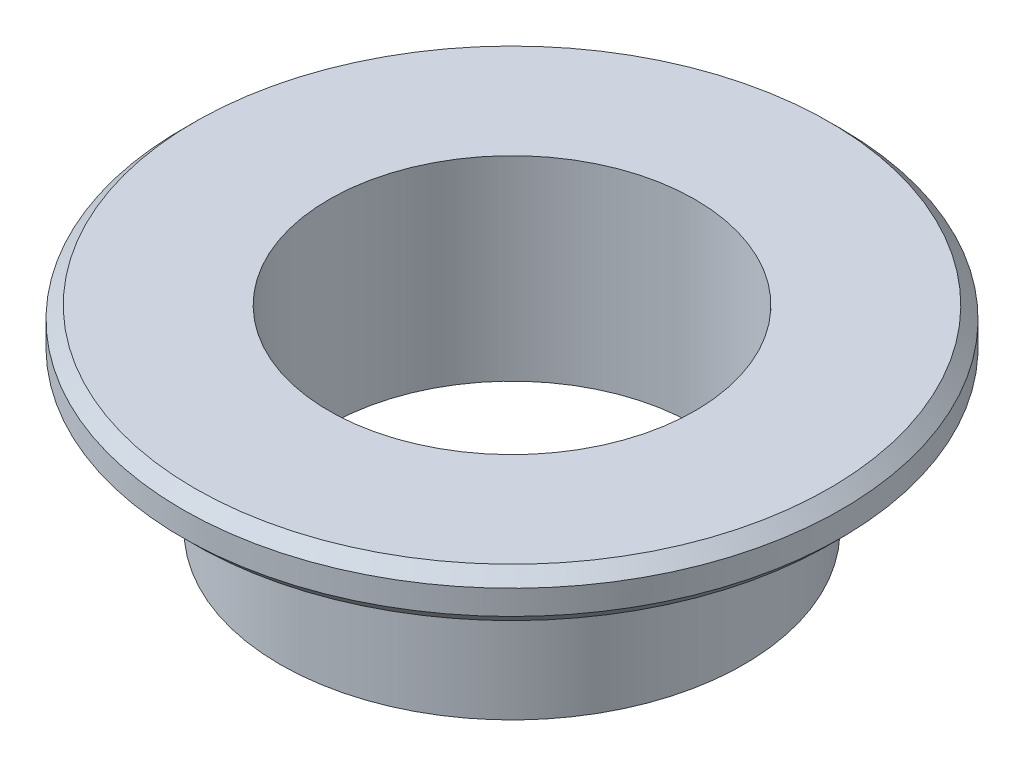
ISO-10303-21;
HEADER;
FILE_DESCRIPTION(('STEP AP214'),'2;1');
FILE_NAME('part.step','',(''),(''),'','','');
FILE_SCHEMA(('AUTOMOTIVE_DESIGN { 1 0 10303 214 1 1 1 1 }'));
ENDSEC;
DATA;
#1=APPLICATION_CONTEXT('core data for automotive mechanical design processes');
#2=APPLICATION_PROTOCOL_DEFINITION('international standard','automotive_design',2000,#1);
#3=PRODUCT_CONTEXT('',#1,'mechanical');
#4=PRODUCT('Part','Part','',(#3));
#5=PRODUCT_RELATED_PRODUCT_CATEGORY('part','',(#4));
#6=PRODUCT_DEFINITION_FORMATION('','',#4);
#7=PRODUCT_DEFINITION_CONTEXT('part definition',#1,'design');
#8=PRODUCT_DEFINITION('design','',#6,#7);
#9=PRODUCT_DEFINITION_SHAPE('','',#8);
#10=(LENGTH_UNIT() NAMED_UNIT(*) SI_UNIT(.MILLI.,.METRE.));
#11=(NAMED_UNIT(*) PLANE_ANGLE_UNIT() SI_UNIT($,.RADIAN.));
#12=(NAMED_UNIT(*) SI_UNIT($,.STERADIAN.) SOLID_ANGLE_UNIT());
#13=UNCERTAINTY_MEASURE_WITH_UNIT(LENGTH_MEASURE(1.E-05),#10,'distance_accuracy_value','');
#14=(GEOMETRIC_REPRESENTATION_CONTEXT(3) GLOBAL_UNCERTAINTY_ASSIGNED_CONTEXT((#13)) GLOBAL_UNIT_ASSIGNED_CONTEXT((#10,
#11,#12)) REPRESENTATION_CONTEXT('',''));
#15=CARTESIAN_POINT('',(0.,0.,0.));
#16=DIRECTION('',(0.,0.,1.));
#17=DIRECTION('',(1.,0.,0.));
#18=AXIS2_PLACEMENT_3D('',#15,#16,#17);
#19=CARTESIAN_POINT('',(13.5,8.,0.));
#20=DIRECTION('',(0.,1.,0.));
#21=DIRECTION('',(0.,0.,1.));
#22=AXIS2_PLACEMENT_3D('',#19,#20,#21);
#23=PLANE('',#22);
#24=CARTESIAN_POINT('',(0.,8.,0.));
#25=DIRECTION('',(0.,1.,0.));
#26=DIRECTION('',(0.,0.,1.));
#27=AXIS2_PLACEMENT_3D('',#24,#25,#26);
#28=CIRCLE('',#27,13.);
#29=CARTESIAN_POINT('',(0.,8.,13.));
#30=VERTEX_POINT('',#29);
#31=EDGE_CURVE('E10',#30,#30,#28,.T.);
#32=ORIENTED_EDGE('',*,*,#31,.T.);
#33=EDGE_LOOP('',(#32));
#34=FACE_BOUND('',#33,.T.);
#35=CARTESIAN_POINT('',(0.,8.,0.));
#36=DIRECTION('',(0.,-1.,0.));
#37=DIRECTION('',(0.,0.,-1.));
#38=AXIS2_PLACEMENT_3D('',#35,#36,#37);
#39=CIRCLE('',#38,7.5);
#40=CARTESIAN_POINT('',(0.,8.,-7.5));
#41=VERTEX_POINT('',#40);
#42=EDGE_CURVE('E64',#41,#41,#39,.T.);
#43=ORIENTED_EDGE('',*,*,#42,.T.);
#44=EDGE_LOOP('',(#43));
#45=FACE_BOUND('',#44,.T.);
#46=ADVANCED_FACE('F39',(#34,#45),#23,.T.);
#47=CARTESIAN_POINT('',(0.,0.,0.));
#48=DIRECTION('',(0.,-1.,0.));
#49=DIRECTION('',(0.,0.,-1.));
#50=AXIS2_PLACEMENT_3D('',#47,#48,#49);
#51=CYLINDRICAL_SURFACE('',#50,7.5);
#52=CARTESIAN_POINT('',(0.,0.,0.));
#53=DIRECTION('',(0.,-1.,0.));
#54=DIRECTION('',(0.,0.,-1.));
#55=AXIS2_PLACEMENT_3D('',#52,#53,#54);
#56=CIRCLE('',#55,7.5);
#57=CARTESIAN_POINT('',(0.,0.,-7.5));
#58=VERTEX_POINT('',#57);
#59=EDGE_CURVE('E68',#58,#58,#56,.T.);
#60=ORIENTED_EDGE('',*,*,#59,.T.);
#61=EDGE_LOOP('',(#60));
#62=FACE_BOUND('',#61,.T.);
#63=ORIENTED_EDGE('',*,*,#42,.F.);
#64=EDGE_LOOP('',(#63));
#65=FACE_BOUND('',#64,.T.);
#66=ADVANCED_FACE('F98',(#62,#65),#51,.F.);
#67=CARTESIAN_POINT('',(7.5,0.,0.));
#68=DIRECTION('',(0.,-1.,0.));
#69=DIRECTION('',(0.,0.,-1.));
#70=AXIS2_PLACEMENT_3D('',#67,#68,#69);
#71=PLANE('',#70);
#72=CARTESIAN_POINT('',(0.,0.,0.));
#73=DIRECTION('',(0.,-1.,0.));
#74=DIRECTION('',(0.,0.,-1.));
#75=AXIS2_PLACEMENT_3D('',#72,#73,#74);
#76=CIRCLE('',#75,9.5);
#77=CARTESIAN_POINT('',(0.,0.,-9.5));
#78=VERTEX_POINT('',#77);
#79=EDGE_CURVE('E72',#78,#78,#76,.T.);
#80=ORIENTED_EDGE('',*,*,#79,.T.);
#81=EDGE_LOOP('',(#80));
#82=FACE_BOUND('',#81,.T.);
#83=ORIENTED_EDGE('',*,*,#59,.F.);
#84=EDGE_LOOP('',(#83));
#85=FACE_BOUND('',#84,.T.);
#86=ADVANCED_FACE('F95',(#82,#85),#71,.T.);
#87=CARTESIAN_POINT('',(0.,0.,0.));
#88=DIRECTION('',(0.,-1.,0.));
#89=DIRECTION('',(0.,0.,-1.));
#90=AXIS2_PLACEMENT_3D('',#87,#88,#89);
#91=CYLINDRICAL_SURFACE('',#90,9.5);
#92=CARTESIAN_POINT('',(0.,6.,0.));
#93=DIRECTION('',(0.,-1.,0.));
#94=DIRECTION('',(0.,0.,-1.));
#95=AXIS2_PLACEMENT_3D('',#92,#93,#94);
#96=CIRCLE('',#95,9.5);
#97=CARTESIAN_POINT('',(0.,6.,-9.5));
#98=VERTEX_POINT('',#97);
#99=EDGE_CURVE('E76',#98,#98,#96,.T.);
#100=ORIENTED_EDGE('',*,*,#99,.T.);
#101=EDGE_LOOP('',(#100));
#102=FACE_BOUND('',#101,.T.);
#103=ORIENTED_EDGE('',*,*,#79,.F.);
#104=EDGE_LOOP('',(#103));
#105=FACE_BOUND('',#104,.T.);
#106=ADVANCED_FACE('F81',(#102,#105),#91,.T.);
#107=CARTESIAN_POINT('',(9.5,6.,0.));
#108=DIRECTION('',(0.,-1.,0.));
#109=DIRECTION('',(0.,0.,-1.));
#110=AXIS2_PLACEMENT_3D('',#107,#108,#109);
#111=PLANE('',#110);
#112=CARTESIAN_POINT('',(0.,6.,0.));
#113=DIRECTION('',(0.,-1.,0.));
#114=DIRECTION('',(0.,0.,-1.));
#115=AXIS2_PLACEMENT_3D('',#112,#113,#114);
#116=CIRCLE('',#115,13.);
#117=CARTESIAN_POINT('',(0.,6.,-13.));
#118=VERTEX_POINT('',#117);
#119=EDGE_CURVE('E58',#118,#118,#116,.T.);
#120=ORIENTED_EDGE('',*,*,#119,.T.);
#121=EDGE_LOOP('',(#120));
#122=FACE_BOUND('',#121,.T.);
#123=ORIENTED_EDGE('',*,*,#99,.F.);
#124=EDGE_LOOP('',(#123));
#125=FACE_BOUND('',#124,.T.);
#126=ADVANCED_FACE('F84',(#122,#125),#111,.T.);
#127=CARTESIAN_POINT('',(0.,0.,0.));
#128=DIRECTION('',(0.,-1.,0.));
#129=DIRECTION('',(0.,0.,-1.));
#130=AXIS2_PLACEMENT_3D('',#127,#128,#129);
#131=CYLINDRICAL_SURFACE('',#130,13.5);
#132=CARTESIAN_POINT('',(0.,6.50000000000001,0.));
#133=DIRECTION('',(0.,-1.,0.));
#134=DIRECTION('',(0.,0.,-1.));
#135=AXIS2_PLACEMENT_3D('',#132,#133,#134);
#136=CIRCLE('',#135,13.5);
#137=CARTESIAN_POINT('',(0.,6.50000000000001,-13.5));
#138=VERTEX_POINT('',#137);
#139=EDGE_CURVE('E48',#138,#138,#136,.F.);
#140=ORIENTED_EDGE('',*,*,#139,.T.);
#141=EDGE_LOOP('',(#140));
#142=FACE_BOUND('',#141,.T.);
#143=CARTESIAN_POINT('',(0.,7.49999999999999,0.));
#144=DIRECTION('',(0.,1.,0.));
#145=DIRECTION('',(0.,0.,1.));
#146=AXIS2_PLACEMENT_3D('',#143,#144,#145);
#147=CIRCLE('',#146,13.5);
#148=CARTESIAN_POINT('',(0.,7.49999999999999,13.5));
#149=VERTEX_POINT('',#148);
#150=EDGE_CURVE('E53',#149,#149,#147,.F.);
#151=ORIENTED_EDGE('',*,*,#150,.T.);
#152=EDGE_LOOP('',(#151));
#153=FACE_BOUND('',#152,.T.);
#154=ADVANCED_FACE('F86',(#142,#153),#131,.T.);
#155=CARTESIAN_POINT('',(0.,6.,0.));
#156=DIRECTION('',(0.,1.,0.));
#157=DIRECTION('',(0.,0.,1.));
#158=AXIS2_PLACEMENT_3D('',#155,#156,#157);
#159=CONICAL_SURFACE('',#158,13.,0.785398163397443);
#160=ORIENTED_EDGE('',*,*,#139,.F.);
#161=EDGE_LOOP('',(#160));
#162=FACE_BOUND('',#161,.T.);
#163=ORIENTED_EDGE('',*,*,#119,.F.);
#164=EDGE_LOOP('',(#163));
#165=FACE_BOUND('',#164,.T.);
#166=ADVANCED_FACE('F93',(#162,#165),#159,.T.);
#167=CARTESIAN_POINT('',(0.,7.49999999999999,0.));
#168=DIRECTION('',(0.,-1.,0.));
#169=DIRECTION('',(0.,0.,-1.));
#170=AXIS2_PLACEMENT_3D('',#167,#168,#169);
#171=CONICAL_SURFACE('',#170,13.5,0.78539816339745);
#172=ORIENTED_EDGE('',*,*,#31,.F.);
#173=EDGE_LOOP('',(#172));
#174=FACE_BOUND('',#173,.T.);
#175=ORIENTED_EDGE('',*,*,#150,.F.);
#176=EDGE_LOOP('',(#175));
#177=FACE_BOUND('',#176,.T.);
#178=ADVANCED_FACE('F42',(#174,#177),#171,.T.);
#179=CLOSED_SHELL('',(#46,#66,#86,#106,#126,#154,#166,#178));
#180=MANIFOLD_SOLID_BREP('B2',#179);
#181=ADVANCED_BREP_SHAPE_REPRESENTATION('',(#18,#180),#14);
#182=SHAPE_DEFINITION_REPRESENTATION(#9,#181);
ENDSEC;
END-ISO-10303-21;
